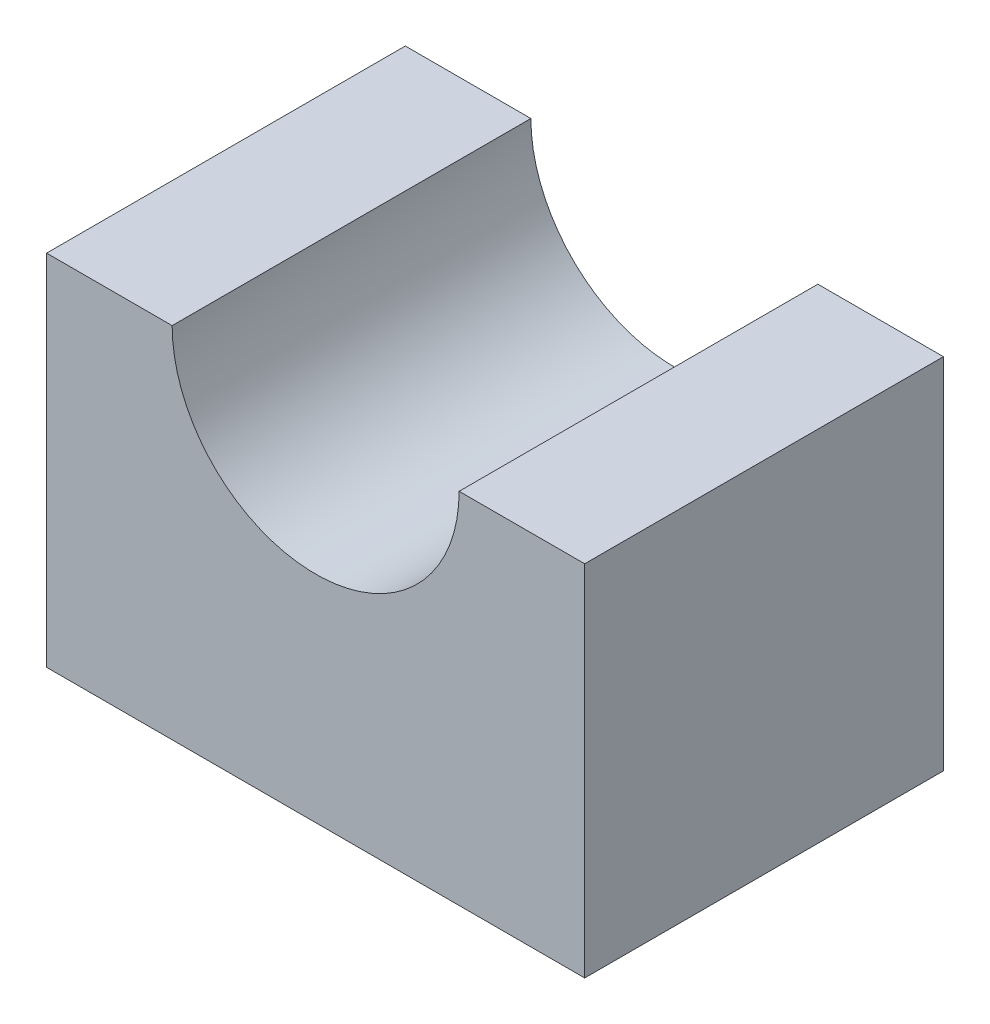
ISO-10303-21;
HEADER;
FILE_DESCRIPTION(('STEP AP214'),'2;1');
FILE_NAME('part.step','',(''),(''),'','','');
FILE_SCHEMA(('AUTOMOTIVE_DESIGN { 1 0 10303 214 1 1 1 1 }'));
ENDSEC;
DATA;
#1=APPLICATION_CONTEXT('core data for automotive mechanical design processes');
#2=APPLICATION_PROTOCOL_DEFINITION('international standard','automotive_design',2000,#1);
#3=PRODUCT_CONTEXT('',#1,'mechanical');
#4=PRODUCT('Part','Part','',(#3));
#5=PRODUCT_RELATED_PRODUCT_CATEGORY('part','',(#4));
#6=PRODUCT_DEFINITION_FORMATION('','',#4);
#7=PRODUCT_DEFINITION_CONTEXT('part definition',#1,'design');
#8=PRODUCT_DEFINITION('design','',#6,#7);
#9=PRODUCT_DEFINITION_SHAPE('','',#8);
#10=(LENGTH_UNIT() NAMED_UNIT(*) SI_UNIT(.MILLI.,.METRE.));
#11=(NAMED_UNIT(*) PLANE_ANGLE_UNIT() SI_UNIT($,.RADIAN.));
#12=(NAMED_UNIT(*) SI_UNIT($,.STERADIAN.) SOLID_ANGLE_UNIT());
#13=UNCERTAINTY_MEASURE_WITH_UNIT(LENGTH_MEASURE(1.E-05),#10,'distance_accuracy_value','');
#14=(GEOMETRIC_REPRESENTATION_CONTEXT(3) GLOBAL_UNCERTAINTY_ASSIGNED_CONTEXT((#13)) GLOBAL_UNIT_ASSIGNED_CONTEXT((#10,
#11,#12)) REPRESENTATION_CONTEXT('',''));
#15=CARTESIAN_POINT('',(0.,0.,0.));
#16=DIRECTION('',(0.,0.,1.));
#17=DIRECTION('',(1.,0.,0.));
#18=AXIS2_PLACEMENT_3D('',#15,#16,#17);
#19=CARTESIAN_POINT('',(-15.,0.,10.));
#20=DIRECTION('',(1.,0.,0.));
#21=DIRECTION('',(0.,1.,0.));
#22=AXIS2_PLACEMENT_3D('',#19,#20,#21);
#23=PLANE('',#22);
#24=DIRECTION('',(0.,-1.,0.));
#25=VECTOR('',#24,1.);
#26=CARTESIAN_POINT('',(-15.,0.,-10.));
#27=LINE('',#26,#25);
#28=CARTESIAN_POINT('',(-15.,0.,-10.));
#29=VERTEX_POINT('',#28);
#30=CARTESIAN_POINT('',(-15.,-20.,-10.));
#31=VERTEX_POINT('',#30);
#32=EDGE_CURVE('E119',#29,#31,#27,.T.);
#33=ORIENTED_EDGE('',*,*,#32,.T.);
#34=DIRECTION('',(0.,0.,-1.));
#35=VECTOR('',#34,1.);
#36=CARTESIAN_POINT('',(-15.,-20.,10.));
#37=LINE('',#36,#35);
#38=CARTESIAN_POINT('',(-15.,-20.,10.));
#39=VERTEX_POINT('',#38);
#40=EDGE_CURVE('E11',#39,#31,#37,.T.);
#41=ORIENTED_EDGE('',*,*,#40,.F.);
#42=DIRECTION('',(0.,-1.,0.));
#43=VECTOR('',#42,1.);
#44=CARTESIAN_POINT('',(-15.,0.,10.));
#45=LINE('',#44,#43);
#46=CARTESIAN_POINT('',(-15.,0.,10.));
#47=VERTEX_POINT('',#46);
#48=EDGE_CURVE('E129',#47,#39,#45,.T.);
#49=ORIENTED_EDGE('',*,*,#48,.F.);
#50=DIRECTION('',(0.,0.,-1.));
#51=VECTOR('',#50,1.);
#52=CARTESIAN_POINT('',(-15.,0.,10.));
#53=LINE('',#52,#51);
#54=EDGE_CURVE('E115',#47,#29,#53,.T.);
#55=ORIENTED_EDGE('',*,*,#54,.T.);
#56=EDGE_LOOP('',(#33,#41,#49,#55));
#57=FACE_BOUND('',#56,.T.);
#58=ADVANCED_FACE('F35',(#57),#23,.F.);
#59=CARTESIAN_POINT('',(-15.,-20.,10.));
#60=DIRECTION('',(0.,1.,0.));
#61=DIRECTION('',(-1.,0.,0.));
#62=AXIS2_PLACEMENT_3D('',#59,#60,#61);
#63=PLANE('',#62);
#64=DIRECTION('',(1.,0.,0.));
#65=VECTOR('',#64,1.);
#66=CARTESIAN_POINT('',(-15.,-20.,-10.));
#67=LINE('',#66,#65);
#68=CARTESIAN_POINT('',(15.,-20.,-10.));
#69=VERTEX_POINT('',#68);
#70=EDGE_CURVE('E122',#31,#69,#67,.T.);
#71=ORIENTED_EDGE('',*,*,#70,.T.);
#72=DIRECTION('',(0.,0.,-1.));
#73=VECTOR('',#72,1.);
#74=CARTESIAN_POINT('',(15.,-20.,10.));
#75=LINE('',#74,#73);
#76=CARTESIAN_POINT('',(15.,-20.,10.));
#77=VERTEX_POINT('',#76);
#78=EDGE_CURVE('E43',#77,#69,#75,.T.);
#79=ORIENTED_EDGE('',*,*,#78,.F.);
#80=DIRECTION('',(1.,0.,0.));
#81=VECTOR('',#80,1.);
#82=CARTESIAN_POINT('',(-15.,-20.,10.));
#83=LINE('',#82,#81);
#84=EDGE_CURVE('E88',#39,#77,#83,.T.);
#85=ORIENTED_EDGE('',*,*,#84,.F.);
#86=ORIENTED_EDGE('',*,*,#40,.T.);
#87=EDGE_LOOP('',(#71,#79,#85,#86));
#88=FACE_BOUND('',#87,.T.);
#89=ADVANCED_FACE('F153',(#88),#63,.F.);
#90=CARTESIAN_POINT('',(15.,0.,10.));
#91=DIRECTION('',(-1.,0.,0.));
#92=DIRECTION('',(0.,0.,1.));
#93=AXIS2_PLACEMENT_3D('',#90,#91,#92);
#94=PLANE('',#93);
#95=DIRECTION('',(0.,1.,0.));
#96=VECTOR('',#95,1.);
#97=CARTESIAN_POINT('',(15.,0.,-10.));
#98=LINE('',#97,#96);
#99=CARTESIAN_POINT('',(15.,0.,-10.));
#100=VERTEX_POINT('',#99);
#101=EDGE_CURVE('E124',#69,#100,#98,.T.);
#102=ORIENTED_EDGE('',*,*,#101,.T.);
#103=DIRECTION('',(0.,0.,-1.));
#104=VECTOR('',#103,1.);
#105=CARTESIAN_POINT('',(15.,0.,10.));
#106=LINE('',#105,#104);
#107=CARTESIAN_POINT('',(15.,0.,10.));
#108=VERTEX_POINT('',#107);
#109=EDGE_CURVE('E110',#108,#100,#106,.T.);
#110=ORIENTED_EDGE('',*,*,#109,.F.);
#111=DIRECTION('',(0.,1.,0.));
#112=VECTOR('',#111,1.);
#113=CARTESIAN_POINT('',(15.,0.,10.));
#114=LINE('',#113,#112);
#115=EDGE_CURVE('E101',#77,#108,#114,.T.);
#116=ORIENTED_EDGE('',*,*,#115,.F.);
#117=ORIENTED_EDGE('',*,*,#78,.T.);
#118=EDGE_LOOP('',(#102,#110,#116,#117));
#119=FACE_BOUND('',#118,.T.);
#120=ADVANCED_FACE('F135',(#119),#94,.F.);
#121=CARTESIAN_POINT('',(8.,0.,10.));
#122=DIRECTION('',(0.,-1.,0.));
#123=DIRECTION('',(1.,0.,0.));
#124=AXIS2_PLACEMENT_3D('',#121,#122,#123);
#125=PLANE('',#124);
#126=DIRECTION('',(-1.,0.,0.));
#127=VECTOR('',#126,1.);
#128=CARTESIAN_POINT('',(8.,0.,-10.));
#129=LINE('',#128,#127);
#130=CARTESIAN_POINT('',(8.,0.,-10.));
#131=VERTEX_POINT('',#130);
#132=EDGE_CURVE('E109',#100,#131,#129,.T.);
#133=ORIENTED_EDGE('',*,*,#132,.T.);
#134=DIRECTION('',(0.,0.,-1.));
#135=VECTOR('',#134,1.);
#136=CARTESIAN_POINT('',(8.,0.,10.));
#137=LINE('',#136,#135);
#138=CARTESIAN_POINT('',(8.,0.,10.));
#139=VERTEX_POINT('',#138);
#140=EDGE_CURVE('E106',#139,#131,#137,.T.);
#141=ORIENTED_EDGE('',*,*,#140,.F.);
#142=DIRECTION('',(-1.,0.,0.));
#143=VECTOR('',#142,1.);
#144=CARTESIAN_POINT('',(8.,0.,10.));
#145=LINE('',#144,#143);
#146=EDGE_CURVE('E95',#108,#139,#145,.T.);
#147=ORIENTED_EDGE('',*,*,#146,.F.);
#148=ORIENTED_EDGE('',*,*,#109,.T.);
#149=EDGE_LOOP('',(#133,#141,#147,#148));
#150=FACE_BOUND('',#149,.T.);
#151=ADVANCED_FACE('F107',(#150),#125,.F.);
#152=CARTESIAN_POINT('',(0.,0.,10.));
#153=DIRECTION('',(0.,0.,-1.));
#154=DIRECTION('',(-1.,0.,0.));
#155=AXIS2_PLACEMENT_3D('',#152,#153,#154);
#156=CYLINDRICAL_SURFACE('',#155,8.);
#157=CARTESIAN_POINT('',(0.,0.,-10.));
#158=DIRECTION('',(0.,0.,-1.));
#159=DIRECTION('',(1.,0.,0.));
#160=AXIS2_PLACEMENT_3D('',#157,#158,#159);
#161=CIRCLE('',#160,8.);
#162=CARTESIAN_POINT('',(-8.,0.,-10.));
#163=VERTEX_POINT('',#162);
#164=EDGE_CURVE('E74',#131,#163,#161,.T.);
#165=ORIENTED_EDGE('',*,*,#164,.T.);
#166=DIRECTION('',(0.,0.,-1.));
#167=VECTOR('',#166,1.);
#168=CARTESIAN_POINT('',(-8.,0.,10.));
#169=LINE('',#168,#167);
#170=CARTESIAN_POINT('',(-8.,0.,10.));
#171=VERTEX_POINT('',#170);
#172=EDGE_CURVE('E111',#171,#163,#169,.T.);
#173=ORIENTED_EDGE('',*,*,#172,.F.);
#174=CARTESIAN_POINT('',(0.,0.,10.));
#175=DIRECTION('',(0.,0.,-1.));
#176=DIRECTION('',(1.,0.,0.));
#177=AXIS2_PLACEMENT_3D('',#174,#175,#176);
#178=CIRCLE('',#177,8.);
#179=EDGE_CURVE('E99',#139,#171,#178,.T.);
#180=ORIENTED_EDGE('',*,*,#179,.F.);
#181=ORIENTED_EDGE('',*,*,#140,.T.);
#182=EDGE_LOOP('',(#165,#173,#180,#181));
#183=FACE_BOUND('',#182,.T.);
#184=ADVANCED_FACE('F113',(#183),#156,.F.);
#185=CARTESIAN_POINT('',(-15.,0.,10.));
#186=DIRECTION('',(0.,-1.,0.));
#187=DIRECTION('',(1.,0.,0.));
#188=AXIS2_PLACEMENT_3D('',#185,#186,#187);
#189=PLANE('',#188);
#190=DIRECTION('',(-1.,0.,0.));
#191=VECTOR('',#190,1.);
#192=CARTESIAN_POINT('',(-15.,0.,-10.));
#193=LINE('',#192,#191);
#194=EDGE_CURVE('E80',#163,#29,#193,.T.);
#195=ORIENTED_EDGE('',*,*,#194,.T.);
#196=ORIENTED_EDGE('',*,*,#54,.F.);
#197=DIRECTION('',(-1.,0.,0.));
#198=VECTOR('',#197,1.);
#199=CARTESIAN_POINT('',(-15.,0.,10.));
#200=LINE('',#199,#198);
#201=EDGE_CURVE('E51',#171,#47,#200,.T.);
#202=ORIENTED_EDGE('',*,*,#201,.F.);
#203=ORIENTED_EDGE('',*,*,#172,.T.);
#204=EDGE_LOOP('',(#195,#196,#202,#203));
#205=FACE_BOUND('',#204,.T.);
#206=ADVANCED_FACE('F142',(#205),#189,.F.);
#207=CARTESIAN_POINT('',(0.,0.,10.));
#208=DIRECTION('',(0.,0.,1.));
#209=DIRECTION('',(1.,0.,0.));
#210=AXIS2_PLACEMENT_3D('',#207,#208,#209);
#211=PLANE('',#210);
#212=ORIENTED_EDGE('',*,*,#48,.T.);
#213=ORIENTED_EDGE('',*,*,#84,.T.);
#214=ORIENTED_EDGE('',*,*,#115,.T.);
#215=ORIENTED_EDGE('',*,*,#146,.T.);
#216=ORIENTED_EDGE('',*,*,#179,.T.);
#217=ORIENTED_EDGE('',*,*,#201,.T.);
#218=EDGE_LOOP('',(#212,#213,#214,#215,#216,#217));
#219=FACE_BOUND('',#218,.T.);
#220=ADVANCED_FACE('F97',(#219),#211,.T.);
#221=CARTESIAN_POINT('',(0.,0.,-10.));
#222=DIRECTION('',(0.,0.,1.));
#223=DIRECTION('',(1.,0.,0.));
#224=AXIS2_PLACEMENT_3D('',#221,#222,#223);
#225=PLANE('',#224);
#226=ORIENTED_EDGE('',*,*,#32,.F.);
#227=ORIENTED_EDGE('',*,*,#194,.F.);
#228=ORIENTED_EDGE('',*,*,#164,.F.);
#229=ORIENTED_EDGE('',*,*,#132,.F.);
#230=ORIENTED_EDGE('',*,*,#101,.F.);
#231=ORIENTED_EDGE('',*,*,#70,.F.);
#232=EDGE_LOOP('',(#226,#227,#228,#229,#230,#231));
#233=FACE_BOUND('',#232,.T.);
#234=ADVANCED_FACE('F138',(#233),#225,.F.);
#235=CLOSED_SHELL('',(#58,#89,#120,#151,#184,#206,#220,#234));
#236=MANIFOLD_SOLID_BREP('B2',#235);
#237=ADVANCED_BREP_SHAPE_REPRESENTATION('',(#18,#236),#14);
#238=SHAPE_DEFINITION_REPRESENTATION(#9,#237);
ENDSEC;
END-ISO-10303-21;
